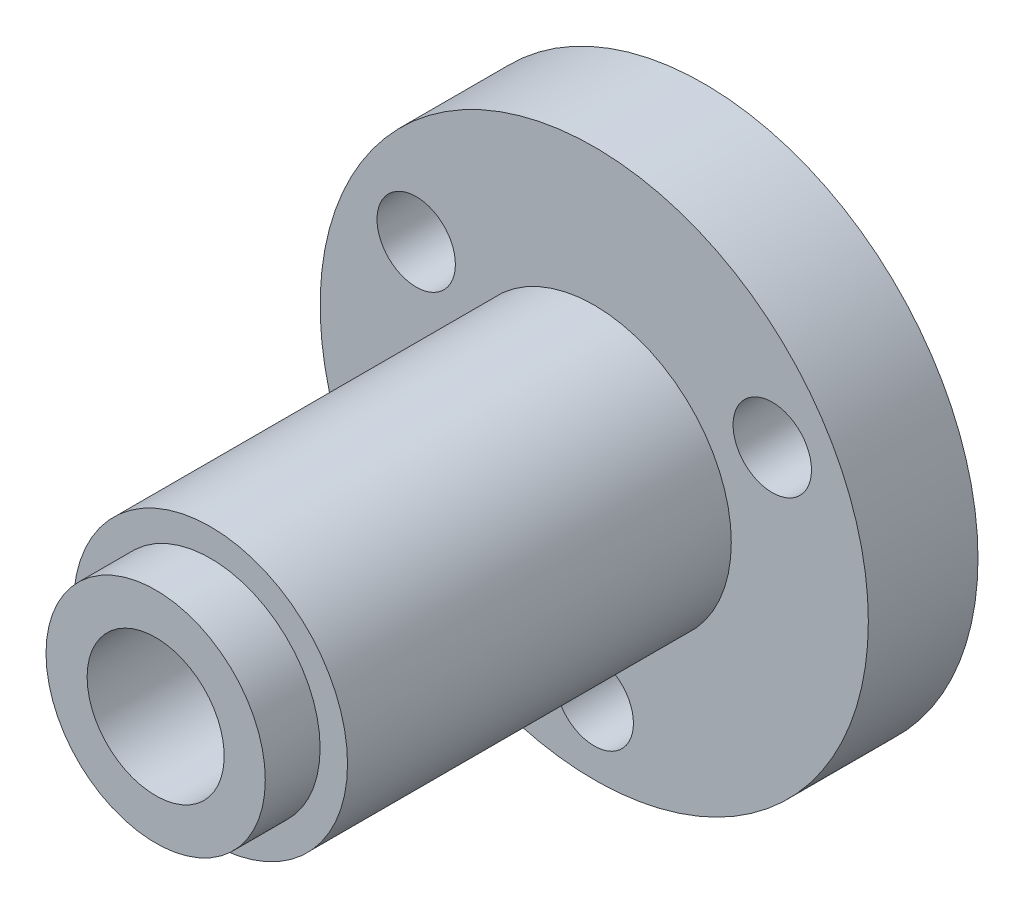
ISO-10303-21;
HEADER;
FILE_DESCRIPTION(('STEP AP214'),'2;1');
FILE_NAME('part.step','',(''),(''),'','','');
FILE_SCHEMA(('AUTOMOTIVE_DESIGN { 1 0 10303 214 1 1 1 1 }'));
ENDSEC;
DATA;
#1=APPLICATION_CONTEXT('core data for automotive mechanical design processes');
#2=APPLICATION_PROTOCOL_DEFINITION('international standard','automotive_design',2000,#1);
#3=PRODUCT_CONTEXT('',#1,'mechanical');
#4=PRODUCT('Part','Part','',(#3));
#5=PRODUCT_RELATED_PRODUCT_CATEGORY('part','',(#4));
#6=PRODUCT_DEFINITION_FORMATION('','',#4);
#7=PRODUCT_DEFINITION_CONTEXT('part definition',#1,'design');
#8=PRODUCT_DEFINITION('design','',#6,#7);
#9=PRODUCT_DEFINITION_SHAPE('','',#8);
#10=(LENGTH_UNIT() NAMED_UNIT(*) SI_UNIT(.MILLI.,.METRE.));
#11=(NAMED_UNIT(*) PLANE_ANGLE_UNIT() SI_UNIT($,.RADIAN.));
#12=(NAMED_UNIT(*) SI_UNIT($,.STERADIAN.) SOLID_ANGLE_UNIT());
#13=UNCERTAINTY_MEASURE_WITH_UNIT(LENGTH_MEASURE(1.E-05),#10,'distance_accuracy_value','');
#14=(GEOMETRIC_REPRESENTATION_CONTEXT(3) GLOBAL_UNCERTAINTY_ASSIGNED_CONTEXT((#13)) GLOBAL_UNIT_ASSIGNED_CONTEXT((#10,
#11,#12)) REPRESENTATION_CONTEXT('',''));
#15=CARTESIAN_POINT('',(0.,0.,0.));
#16=DIRECTION('',(0.,0.,1.));
#17=DIRECTION('',(1.,0.,0.));
#18=AXIS2_PLACEMENT_3D('',#15,#16,#17);
#19=CARTESIAN_POINT('',(0.,9.525,22.86));
#20=DIRECTION('',(0.,0.,-1.));
#21=DIRECTION('',(-1.,0.,0.));
#22=AXIS2_PLACEMENT_3D('',#19,#20,#21);
#23=CYLINDRICAL_SURFACE('',#22,6.35);
#24=CARTESIAN_POINT('',(0.,9.525,2.54));
#25=DIRECTION('',(0.,0.,1.));
#26=DIRECTION('',(1.,0.,0.));
#27=AXIS2_PLACEMENT_3D('',#24,#25,#26);
#28=CIRCLE('',#27,6.35);
#29=CARTESIAN_POINT('',(6.35,9.525,2.54));
#30=VERTEX_POINT('',#29);
#31=EDGE_CURVE('E59',#30,#30,#28,.T.);
#32=ORIENTED_EDGE('',*,*,#31,.T.);
#33=EDGE_LOOP('',(#32));
#34=FACE_BOUND('',#33,.T.);
#35=CARTESIAN_POINT('',(0.,9.525,20.32));
#36=DIRECTION('',(0.,0.,1.));
#37=DIRECTION('',(1.,0.,0.));
#38=AXIS2_PLACEMENT_3D('',#35,#36,#37);
#39=CIRCLE('',#38,6.35);
#40=CARTESIAN_POINT('',(6.35,9.525,20.32));
#41=VERTEX_POINT('',#40);
#42=EDGE_CURVE('E68',#41,#41,#39,.T.);
#43=ORIENTED_EDGE('',*,*,#42,.F.);
#44=EDGE_LOOP('',(#43));
#45=FACE_BOUND('',#44,.T.);
#46=ADVANCED_FACE('F31',(#34,#45),#23,.T.);
#47=CARTESIAN_POINT('',(0.,9.525,22.86));
#48=DIRECTION('',(0.,0.,1.));
#49=DIRECTION('',(1.,0.,0.));
#50=AXIS2_PLACEMENT_3D('',#47,#48,#49);
#51=PLANE('',#50);
#52=CARTESIAN_POINT('',(0.,9.525,22.86));
#53=DIRECTION('',(0.,0.,-1.));
#54=DIRECTION('',(-1.,0.,0.));
#55=AXIS2_PLACEMENT_3D('',#52,#53,#54);
#56=CIRCLE('',#55,3.175);
#57=CARTESIAN_POINT('',(-3.175,9.525,22.86));
#58=VERTEX_POINT('',#57);
#59=EDGE_CURVE('E64',#58,#58,#56,.T.);
#60=ORIENTED_EDGE('',*,*,#59,.T.);
#61=EDGE_LOOP('',(#60));
#62=FACE_BOUND('',#61,.T.);
#63=CARTESIAN_POINT('',(0.,9.525,22.86));
#64=DIRECTION('',(0.,0.,1.));
#65=DIRECTION('',(1.,0.,0.));
#66=AXIS2_PLACEMENT_3D('',#63,#64,#65);
#67=CIRCLE('',#66,5.08);
#68=CARTESIAN_POINT('',(5.08,9.525,22.86));
#69=VERTEX_POINT('',#68);
#70=EDGE_CURVE('E71',#69,#69,#67,.T.);
#71=ORIENTED_EDGE('',*,*,#70,.T.);
#72=EDGE_LOOP('',(#71));
#73=FACE_BOUND('',#72,.T.);
#74=ADVANCED_FACE('F90',(#62,#73),#51,.T.);
#75=CARTESIAN_POINT('',(0.,9.525,2.54));
#76=DIRECTION('',(0.,0.,1.));
#77=DIRECTION('',(1.,0.,0.));
#78=AXIS2_PLACEMENT_3D('',#75,#76,#77);
#79=PLANE('',#78);
#80=CARTESIAN_POINT('',(8.24889197104678,14.2875,2.54));
#81=DIRECTION('',(0.,0.,1.));
#82=DIRECTION('',(1.,0.,0.));
#83=AXIS2_PLACEMENT_3D('',#80,#81,#82);
#84=CIRCLE('',#83,1.8161);
#85=CARTESIAN_POINT('',(10.0649919710468,14.2875,2.54));
#86=VERTEX_POINT('',#85);
#87=EDGE_CURVE('E53',#86,#86,#84,.T.);
#88=ORIENTED_EDGE('',*,*,#87,.F.);
#89=EDGE_LOOP('',(#88));
#90=FACE_BOUND('',#89,.T.);
#91=CARTESIAN_POINT('',(0.,0.,2.54));
#92=DIRECTION('',(0.,0.,1.));
#93=DIRECTION('',(1.,0.,0.));
#94=AXIS2_PLACEMENT_3D('',#91,#92,#93);
#95=CIRCLE('',#94,1.8161);
#96=CARTESIAN_POINT('',(1.8161,0.,2.54));
#97=VERTEX_POINT('',#96);
#98=EDGE_CURVE('E42',#97,#97,#95,.T.);
#99=ORIENTED_EDGE('',*,*,#98,.F.);
#100=EDGE_LOOP('',(#99));
#101=FACE_BOUND('',#100,.T.);
#102=CARTESIAN_POINT('',(0.,9.525,2.54));
#103=DIRECTION('',(0.,0.,1.));
#104=DIRECTION('',(1.,0.,0.));
#105=AXIS2_PLACEMENT_3D('',#102,#103,#104);
#106=CIRCLE('',#105,12.7);
#107=CARTESIAN_POINT('',(12.7,9.525,2.54));
#108=VERTEX_POINT('',#107);
#109=EDGE_CURVE('E10',#108,#108,#106,.T.);
#110=ORIENTED_EDGE('',*,*,#109,.T.);
#111=EDGE_LOOP('',(#110));
#112=FACE_BOUND('',#111,.T.);
#113=CARTESIAN_POINT('',(-8.24889197104678,14.2875,2.54));
#114=DIRECTION('',(0.,0.,1.));
#115=DIRECTION('',(1.,0.,0.));
#116=AXIS2_PLACEMENT_3D('',#113,#114,#115);
#117=CIRCLE('',#116,1.8161);
#118=CARTESIAN_POINT('',(-6.43279197104678,14.2875,2.54));
#119=VERTEX_POINT('',#118);
#120=EDGE_CURVE('E47',#119,#119,#117,.T.);
#121=ORIENTED_EDGE('',*,*,#120,.F.);
#122=EDGE_LOOP('',(#121));
#123=FACE_BOUND('',#122,.T.);
#124=ORIENTED_EDGE('',*,*,#31,.F.);
#125=EDGE_LOOP('',(#124));
#126=FACE_BOUND('',#125,.T.);
#127=ADVANCED_FACE('F96',(#90,#101,#112,#123,#126),#79,.T.);
#128=CARTESIAN_POINT('',(0.,9.525,-2.54));
#129=DIRECTION('',(0.,0.,1.));
#130=DIRECTION('',(1.,0.,0.));
#131=AXIS2_PLACEMENT_3D('',#128,#129,#130);
#132=PLANE('',#131);
#133=CARTESIAN_POINT('',(0.,9.525,-2.54));
#134=DIRECTION('',(0.,0.,-1.));
#135=DIRECTION('',(-1.,0.,0.));
#136=AXIS2_PLACEMENT_3D('',#133,#134,#135);
#137=CIRCLE('',#136,3.175);
#138=CARTESIAN_POINT('',(-3.175,9.525,-2.54));
#139=VERTEX_POINT('',#138);
#140=EDGE_CURVE('E65',#139,#139,#137,.T.);
#141=ORIENTED_EDGE('',*,*,#140,.F.);
#142=EDGE_LOOP('',(#141));
#143=FACE_BOUND('',#142,.T.);
#144=CARTESIAN_POINT('',(-8.24889197104678,14.2875,-2.54));
#145=DIRECTION('',(0.,0.,1.));
#146=DIRECTION('',(1.,0.,0.));
#147=AXIS2_PLACEMENT_3D('',#144,#145,#146);
#148=CIRCLE('',#147,1.8161);
#149=CARTESIAN_POINT('',(-6.43279197104678,14.2875,-2.54));
#150=VERTEX_POINT('',#149);
#151=EDGE_CURVE('E50',#150,#150,#148,.T.);
#152=ORIENTED_EDGE('',*,*,#151,.T.);
#153=EDGE_LOOP('',(#152));
#154=FACE_BOUND('',#153,.T.);
#155=CARTESIAN_POINT('',(0.,9.525,-2.54));
#156=DIRECTION('',(0.,0.,1.));
#157=DIRECTION('',(1.,0.,0.));
#158=AXIS2_PLACEMENT_3D('',#155,#156,#157);
#159=CIRCLE('',#158,12.7);
#160=CARTESIAN_POINT('',(12.7,9.525,-2.54));
#161=VERTEX_POINT('',#160);
#162=EDGE_CURVE('E35',#161,#161,#159,.T.);
#163=ORIENTED_EDGE('',*,*,#162,.F.);
#164=EDGE_LOOP('',(#163));
#165=FACE_BOUND('',#164,.T.);
#166=CARTESIAN_POINT('',(0.,0.,-2.54));
#167=DIRECTION('',(0.,0.,1.));
#168=DIRECTION('',(1.,0.,0.));
#169=AXIS2_PLACEMENT_3D('',#166,#167,#168);
#170=CIRCLE('',#169,1.8161);
#171=CARTESIAN_POINT('',(1.8161,0.,-2.54));
#172=VERTEX_POINT('',#171);
#173=EDGE_CURVE('E44',#172,#172,#170,.T.);
#174=ORIENTED_EDGE('',*,*,#173,.T.);
#175=EDGE_LOOP('',(#174));
#176=FACE_BOUND('',#175,.T.);
#177=CARTESIAN_POINT('',(8.24889197104678,14.2875,-2.54));
#178=DIRECTION('',(0.,0.,1.));
#179=DIRECTION('',(1.,0.,0.));
#180=AXIS2_PLACEMENT_3D('',#177,#178,#179);
#181=CIRCLE('',#180,1.8161);
#182=CARTESIAN_POINT('',(10.0649919710468,14.2875,-2.54));
#183=VERTEX_POINT('',#182);
#184=EDGE_CURVE('E56',#183,#183,#181,.T.);
#185=ORIENTED_EDGE('',*,*,#184,.T.);
#186=EDGE_LOOP('',(#185));
#187=FACE_BOUND('',#186,.T.);
#188=ADVANCED_FACE('F115',(#143,#154,#165,#176,#187),#132,.F.);
#189=CARTESIAN_POINT('',(0.,9.525,2.54));
#190=DIRECTION('',(0.,0.,-1.));
#191=DIRECTION('',(-1.,0.,0.));
#192=AXIS2_PLACEMENT_3D('',#189,#190,#191);
#193=CYLINDRICAL_SURFACE('',#192,12.7);
#194=ORIENTED_EDGE('',*,*,#109,.F.);
#195=EDGE_LOOP('',(#194));
#196=FACE_BOUND('',#195,.T.);
#197=ORIENTED_EDGE('',*,*,#162,.T.);
#198=EDGE_LOOP('',(#197));
#199=FACE_BOUND('',#198,.T.);
#200=ADVANCED_FACE('F33',(#196,#199),#193,.T.);
#201=CARTESIAN_POINT('',(0.,0.,2.54));
#202=DIRECTION('',(0.,0.,-1.));
#203=DIRECTION('',(-1.,0.,0.));
#204=AXIS2_PLACEMENT_3D('',#201,#202,#203);
#205=CYLINDRICAL_SURFACE('',#204,1.8161);
#206=ORIENTED_EDGE('',*,*,#98,.T.);
#207=EDGE_LOOP('',(#206));
#208=FACE_BOUND('',#207,.T.);
#209=ORIENTED_EDGE('',*,*,#173,.F.);
#210=EDGE_LOOP('',(#209));
#211=FACE_BOUND('',#210,.T.);
#212=ADVANCED_FACE('F109',(#208,#211),#205,.F.);
#213=CARTESIAN_POINT('',(-8.24889197104678,14.2875,2.54));
#214=DIRECTION('',(0.,0.,-1.));
#215=DIRECTION('',(-1.,0.,0.));
#216=AXIS2_PLACEMENT_3D('',#213,#214,#215);
#217=CYLINDRICAL_SURFACE('',#216,1.8161);
#218=ORIENTED_EDGE('',*,*,#120,.T.);
#219=EDGE_LOOP('',(#218));
#220=FACE_BOUND('',#219,.T.);
#221=ORIENTED_EDGE('',*,*,#151,.F.);
#222=EDGE_LOOP('',(#221));
#223=FACE_BOUND('',#222,.T.);
#224=ADVANCED_FACE('F105',(#220,#223),#217,.F.);
#225=CARTESIAN_POINT('',(8.24889197104678,14.2875,2.54));
#226=DIRECTION('',(0.,0.,-1.));
#227=DIRECTION('',(-1.,0.,0.));
#228=AXIS2_PLACEMENT_3D('',#225,#226,#227);
#229=CYLINDRICAL_SURFACE('',#228,1.8161);
#230=ORIENTED_EDGE('',*,*,#87,.T.);
#231=EDGE_LOOP('',(#230));
#232=FACE_BOUND('',#231,.T.);
#233=ORIENTED_EDGE('',*,*,#184,.F.);
#234=EDGE_LOOP('',(#233));
#235=FACE_BOUND('',#234,.T.);
#236=ADVANCED_FACE('F101',(#232,#235),#229,.F.);
#237=CARTESIAN_POINT('',(0.,9.525,22.86));
#238=DIRECTION('',(0.,0.,-1.));
#239=DIRECTION('',(-1.,0.,0.));
#240=AXIS2_PLACEMENT_3D('',#237,#238,#239);
#241=CYLINDRICAL_SURFACE('',#240,3.175);
#242=CARTESIAN_POINT('',(-3.175,9.525,22.86));
#243=CARTESIAN_POINT('',(-3.175,9.525,22.5954166666667));
#244=CARTESIAN_POINT('',(-3.175,9.525,22.3308333333333));
#245=CARTESIAN_POINT('',(-3.175,9.525,21.8016666666667));
#246=CARTESIAN_POINT('',(-3.175,9.525,21.5370833333333));
#247=CARTESIAN_POINT('',(-3.175,9.525,21.0079166666667));
#248=CARTESIAN_POINT('',(-3.175,9.525,20.7433333333333));
#249=CARTESIAN_POINT('',(-3.175,9.525,20.2141666666667));
#250=CARTESIAN_POINT('',(-3.175,9.525,19.9495833333333));
#251=CARTESIAN_POINT('',(-3.175,9.525,19.4204166666667));
#252=CARTESIAN_POINT('',(-3.175,9.525,19.1558333333333));
#253=CARTESIAN_POINT('',(-3.175,9.525,18.6266666666667));
#254=CARTESIAN_POINT('',(-3.175,9.525,18.3620833333333));
#255=CARTESIAN_POINT('',(-3.175,9.525,17.8329166666667));
#256=CARTESIAN_POINT('',(-3.175,9.525,17.5683333333333));
#257=CARTESIAN_POINT('',(-3.175,9.525,17.0391666666667));
#258=CARTESIAN_POINT('',(-3.175,9.525,16.7745833333333));
#259=CARTESIAN_POINT('',(-3.175,9.525,16.2454166666667));
#260=CARTESIAN_POINT('',(-3.175,9.525,15.9808333333333));
#261=CARTESIAN_POINT('',(-3.175,9.525,15.4516666666667));
#262=CARTESIAN_POINT('',(-3.175,9.525,15.1870833333333));
#263=CARTESIAN_POINT('',(-3.175,9.525,14.6579166666667));
#264=CARTESIAN_POINT('',(-3.175,9.525,14.3933333333333));
#265=CARTESIAN_POINT('',(-3.175,9.525,13.8641666666667));
#266=CARTESIAN_POINT('',(-3.175,9.525,13.5995833333333));
#267=CARTESIAN_POINT('',(-3.175,9.525,13.0704166666667));
#268=CARTESIAN_POINT('',(-3.175,9.525,12.8058333333333));
#269=CARTESIAN_POINT('',(-3.175,9.525,12.2766666666667));
#270=CARTESIAN_POINT('',(-3.175,9.525,12.0120833333333));
#271=CARTESIAN_POINT('',(-3.175,9.525,11.4829166666667));
#272=CARTESIAN_POINT('',(-3.175,9.525,11.2183333333333));
#273=CARTESIAN_POINT('',(-3.175,9.525,10.6891666666667));
#274=CARTESIAN_POINT('',(-3.175,9.525,10.4245833333333));
#275=CARTESIAN_POINT('',(-3.175,9.525,9.89541666666667));
#276=CARTESIAN_POINT('',(-3.175,9.525,9.63083333333334));
#277=CARTESIAN_POINT('',(-3.175,9.525,9.10166666666667));
#278=CARTESIAN_POINT('',(-3.175,9.525,8.83708333333334));
#279=CARTESIAN_POINT('',(-3.175,9.525,8.30791666666667));
#280=CARTESIAN_POINT('',(-3.175,9.525,8.04333333333333));
#281=CARTESIAN_POINT('',(-3.175,9.525,7.51416666666667));
#282=CARTESIAN_POINT('',(-3.175,9.525,7.24958333333333));
#283=CARTESIAN_POINT('',(-3.175,9.525,6.72041666666667));
#284=CARTESIAN_POINT('',(-3.175,9.525,6.45583333333334));
#285=CARTESIAN_POINT('',(-3.175,9.525,5.92666666666667));
#286=CARTESIAN_POINT('',(-3.175,9.525,5.66208333333333));
#287=CARTESIAN_POINT('',(-3.175,9.525,5.13291666666667));
#288=CARTESIAN_POINT('',(-3.175,9.525,4.86833333333333));
#289=CARTESIAN_POINT('',(-3.175,9.525,4.33916666666667));
#290=CARTESIAN_POINT('',(-3.175,9.525,4.07458333333333));
#291=CARTESIAN_POINT('',(-3.175,9.525,3.54541666666667));
#292=CARTESIAN_POINT('',(-3.175,9.525,3.28083333333333));
#293=CARTESIAN_POINT('',(-3.175,9.525,2.75166666666667));
#294=CARTESIAN_POINT('',(-3.175,9.525,2.48708333333334));
#295=CARTESIAN_POINT('',(-3.175,9.525,1.95791666666667));
#296=CARTESIAN_POINT('',(-3.175,9.525,1.69333333333333));
#297=CARTESIAN_POINT('',(-3.175,9.525,1.16416666666667));
#298=CARTESIAN_POINT('',(-3.175,9.525,0.899583333333333));
#299=CARTESIAN_POINT('',(-3.175,9.525,0.370416666666667));
#300=CARTESIAN_POINT('',(-3.175,9.525,0.105833333333334));
#301=CARTESIAN_POINT('',(-3.175,9.525,-0.423333333333334));
#302=CARTESIAN_POINT('',(-3.175,9.525,-0.687916666666668));
#303=CARTESIAN_POINT('',(-3.175,9.525,-1.21708333333334));
#304=CARTESIAN_POINT('',(-3.175,9.525,-1.48166666666667));
#305=CARTESIAN_POINT('',(-3.175,9.525,-2.01083333333333));
#306=CARTESIAN_POINT('',(-3.175,9.525,-2.27541666666667));
#307=CARTESIAN_POINT('',(-3.175,9.525,-2.54));
#308=B_SPLINE_CURVE_WITH_KNOTS('',3,(#242,#243,#244,#245,#246,#247,#248,#249,#250,#251,#252,
#253,#254,#255,#256,#257,#258,#259,#260,#261,#262,#263,#264,#265,#266,#267,#268,#269,#270,#271,
#272,#273,#274,#275,#276,#277,#278,#279,#280,#281,#282,#283,#284,#285,#286,#287,#288,#289,#290,
#291,#292,#293,#294,#295,#296,#297,#298,#299,#300,#301,#302,#303,#304,#305,#306,#307),
.UNSPECIFIED.,.F.,.F.,(4,2,2,2,2,2,2,2,2,2,2,2,2,2,2,2,2,2,2,2,2,2,2,2,2,2,2,2,2,2,2,2,4),(0.,
0.793749999999999,1.5875,2.38125,3.175,3.96875,4.7625,5.55625,6.35,7.14375,7.9375,8.73125,9.525,
10.31875,11.1125,11.90625,12.7,13.49375,14.2875,15.08125,15.875,16.66875,17.4625,18.25625,19.05,
19.84375,20.6375,21.43125,22.225,23.01875,23.8125,24.60625,25.4),.UNSPECIFIED.);
#309=EDGE_CURVE('BSEAM104',#58,#139,#308,.T.);
#310=ORIENTED_EDGE('',*,*,#59,.F.);
#311=ORIENTED_EDGE('',*,*,#140,.T.);
#312=ORIENTED_EDGE('',*,*,#309,.T.);
#313=ORIENTED_EDGE('',*,*,#309,.F.);
#314=EDGE_LOOP('',(#310,#312,#311,#313));
#315=FACE_BOUND('',#314,.T.);
#316=ADVANCED_FACE('F104',(#315),#241,.F.);
#317=CARTESIAN_POINT('',(0.,9.525,20.32));
#318=DIRECTION('',(0.,0.,1.));
#319=DIRECTION('',(1.,0.,0.));
#320=AXIS2_PLACEMENT_3D('',#317,#318,#319);
#321=CYLINDRICAL_SURFACE('',#320,5.08);
#322=CARTESIAN_POINT('',(0.,9.525,20.32));
#323=DIRECTION('',(0.,0.,1.));
#324=DIRECTION('',(1.,0.,0.));
#325=AXIS2_PLACEMENT_3D('',#322,#323,#324);
#326=CIRCLE('',#325,5.08);
#327=CARTESIAN_POINT('',(5.08,9.525,20.32));
#328=VERTEX_POINT('',#327);
#329=EDGE_CURVE('E74',#328,#328,#326,.T.);
#330=ORIENTED_EDGE('',*,*,#329,.T.);
#331=EDGE_LOOP('',(#330));
#332=FACE_BOUND('',#331,.T.);
#333=ORIENTED_EDGE('',*,*,#70,.F.);
#334=EDGE_LOOP('',(#333));
#335=FACE_BOUND('',#334,.T.);
#336=ADVANCED_FACE('F80',(#332,#335),#321,.T.);
#337=CARTESIAN_POINT('',(0.,0.,20.32));
#338=DIRECTION('',(0.,0.,1.));
#339=DIRECTION('',(1.,0.,0.));
#340=AXIS2_PLACEMENT_3D('',#337,#338,#339);
#341=PLANE('',#340);
#342=ORIENTED_EDGE('',*,*,#329,.F.);
#343=EDGE_LOOP('',(#342));
#344=FACE_BOUND('',#343,.T.);
#345=ORIENTED_EDGE('',*,*,#42,.T.);
#346=EDGE_LOOP('',(#345));
#347=FACE_BOUND('',#346,.T.);
#348=ADVANCED_FACE('F83',(#344,#347),#341,.T.);
#349=CLOSED_SHELL('',(#46,#74,#127,#188,#200,#212,#224,#236,#316,#336,#348));
#350=MANIFOLD_SOLID_BREP('B2',#349);
#351=ADVANCED_BREP_SHAPE_REPRESENTATION('',(#18,#350),#14);
#352=SHAPE_DEFINITION_REPRESENTATION(#9,#351);
ENDSEC;
END-ISO-10303-21;
